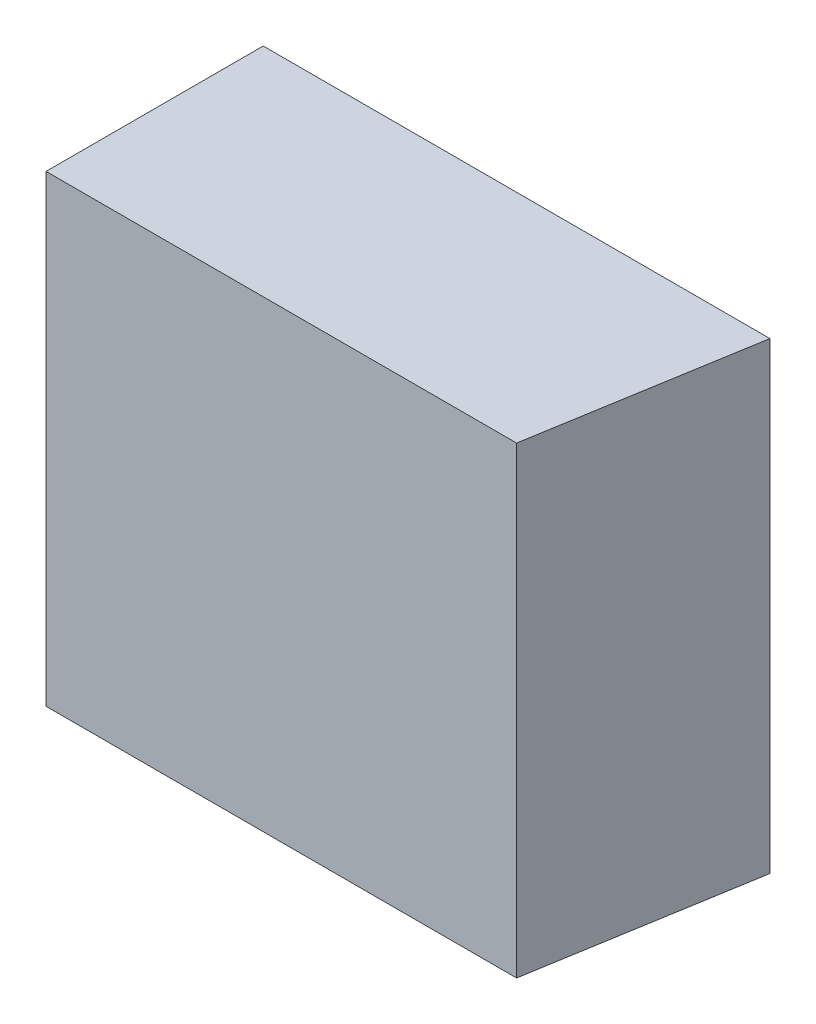
ISO-10303-21;
HEADER;
FILE_DESCRIPTION(('STEP AP214'),'2;1');
FILE_NAME('part.step','',(''),(''),'','','');
FILE_SCHEMA(('AUTOMOTIVE_DESIGN { 1 0 10303 214 1 1 1 1 }'));
ENDSEC;
DATA;
#1=APPLICATION_CONTEXT('core data for automotive mechanical design processes');
#2=APPLICATION_PROTOCOL_DEFINITION('international standard','automotive_design',2000,#1);
#3=PRODUCT_CONTEXT('',#1,'mechanical');
#4=PRODUCT('Part','Part','',(#3));
#5=PRODUCT_RELATED_PRODUCT_CATEGORY('part','',(#4));
#6=PRODUCT_DEFINITION_FORMATION('','',#4);
#7=PRODUCT_DEFINITION_CONTEXT('part definition',#1,'design');
#8=PRODUCT_DEFINITION('design','',#6,#7);
#9=PRODUCT_DEFINITION_SHAPE('','',#8);
#10=(LENGTH_UNIT() NAMED_UNIT(*) SI_UNIT(.MILLI.,.METRE.));
#11=(NAMED_UNIT(*) PLANE_ANGLE_UNIT() SI_UNIT($,.RADIAN.));
#12=(NAMED_UNIT(*) SI_UNIT($,.STERADIAN.) SOLID_ANGLE_UNIT());
#13=UNCERTAINTY_MEASURE_WITH_UNIT(LENGTH_MEASURE(1.E-05),#10,'distance_accuracy_value','');
#14=(GEOMETRIC_REPRESENTATION_CONTEXT(3) GLOBAL_UNCERTAINTY_ASSIGNED_CONTEXT((#13)) GLOBAL_UNIT_ASSIGNED_CONTEXT((#10,
#11,#12)) REPRESENTATION_CONTEXT('',''));
#15=CARTESIAN_POINT('',(0.,0.,0.));
#16=DIRECTION('',(0.,0.,1.));
#17=DIRECTION('',(1.,0.,0.));
#18=AXIS2_PLACEMENT_3D('',#15,#16,#17);
#19=CARTESIAN_POINT('',(0.,160.,0.));
#20=DIRECTION('',(0.,0.,1.));
#21=DIRECTION('',(1.,0.,0.));
#22=AXIS2_PLACEMENT_3D('',#19,#20,#21);
#23=PLANE('',#22);
#24=DIRECTION('',(-1.,0.,0.));
#25=VECTOR('',#24,1.);
#26=CARTESIAN_POINT('',(0.,-160.,0.));
#27=LINE('',#26,#25);
#28=CARTESIAN_POINT('',(200.,-160.,0.));
#29=VERTEX_POINT('',#28);
#30=CARTESIAN_POINT('',(-150.,-160.,0.));
#31=VERTEX_POINT('',#30);
#32=EDGE_CURVE('E185',#29,#31,#27,.T.);
#33=ORIENTED_EDGE('',*,*,#32,.T.);
#34=DIRECTION('',(0.,-1.,0.));
#35=VECTOR('',#34,1.);
#36=CARTESIAN_POINT('',(-150.,160.,0.));
#37=LINE('',#36,#35);
#38=CARTESIAN_POINT('',(-150.,160.,0.));
#39=VERTEX_POINT('',#38);
#40=EDGE_CURVE('E52',#39,#31,#37,.T.);
#41=ORIENTED_EDGE('',*,*,#40,.F.);
#42=DIRECTION('',(-1.,0.,0.));
#43=VECTOR('',#42,1.);
#44=CARTESIAN_POINT('',(200.,160.,0.));
#45=LINE('',#44,#43);
#46=CARTESIAN_POINT('',(200.,160.,0.));
#47=VERTEX_POINT('',#46);
#48=EDGE_CURVE('E96',#47,#39,#45,.T.);
#49=ORIENTED_EDGE('',*,*,#48,.F.);
#50=DIRECTION('',(0.,-1.,0.));
#51=VECTOR('',#50,1.);
#52=CARTESIAN_POINT('',(200.,160.,0.));
#53=LINE('',#52,#51);
#54=EDGE_CURVE('E11',#47,#29,#53,.T.);
#55=ORIENTED_EDGE('',*,*,#54,.T.);
#56=EDGE_LOOP('',(#33,#41,#49,#55));
#57=FACE_BOUND('',#56,.T.);
#58=DIRECTION('',(-1.,0.,0.));
#59=VECTOR('',#58,1.);
#60=CARTESIAN_POINT('',(0.,-156.,0.));
#61=LINE('',#60,#59);
#62=CARTESIAN_POINT('',(195.944824979801,-156.,0.));
#63=VERTEX_POINT('',#62);
#64=CARTESIAN_POINT('',(-146.,-156.,0.));
#65=VERTEX_POINT('',#64);
#66=EDGE_CURVE('E142',#63,#65,#61,.T.);
#67=ORIENTED_EDGE('',*,*,#66,.F.);
#68=DIRECTION('',(0.,-1.,0.));
#69=VECTOR('',#68,1.);
#70=CARTESIAN_POINT('',(195.944824979801,160.,0.));
#71=LINE('',#70,#69);
#72=CARTESIAN_POINT('',(195.944824979801,156.,0.));
#73=VERTEX_POINT('',#72);
#74=EDGE_CURVE('E140',#73,#63,#71,.T.);
#75=ORIENTED_EDGE('',*,*,#74,.F.);
#76=DIRECTION('',(-1.,0.,0.));
#77=VECTOR('',#76,1.);
#78=CARTESIAN_POINT('',(0.,156.,0.));
#79=LINE('',#78,#77);
#80=CARTESIAN_POINT('',(-146.,156.,0.));
#81=VERTEX_POINT('',#80);
#82=EDGE_CURVE('E148',#73,#81,#79,.T.);
#83=ORIENTED_EDGE('',*,*,#82,.T.);
#84=DIRECTION('',(0.,-1.,0.));
#85=VECTOR('',#84,1.);
#86=CARTESIAN_POINT('',(-146.,160.,0.));
#87=LINE('',#86,#85);
#88=EDGE_CURVE('E155',#81,#65,#87,.T.);
#89=ORIENTED_EDGE('',*,*,#88,.T.);
#90=EDGE_LOOP('',(#67,#75,#83,#89));
#91=FACE_BOUND('',#90,.T.);
#92=ADVANCED_FACE('F43',(#57,#91),#23,.F.);
#93=CARTESIAN_POINT('',(175.,160.,150.));
#94=DIRECTION('',(-0.986393923832144,0.,-0.164398987305357));
#95=DIRECTION('',(-0.164398987305357,0.,0.986393923832144));
#96=AXIS2_PLACEMENT_3D('',#93,#94,#95);
#97=PLANE('',#96);
#98=DIRECTION('',(0.164398987305357,0.,-0.986393923832144));
#99=VECTOR('',#98,1.);
#100=CARTESIAN_POINT('',(175.,-160.,150.));
#101=LINE('',#100,#99);
#102=CARTESIAN_POINT('',(175.,-160.,150.));
#103=VERTEX_POINT('',#102);
#104=EDGE_CURVE('E162',#103,#29,#101,.T.);
#105=ORIENTED_EDGE('',*,*,#104,.T.);
#106=ORIENTED_EDGE('',*,*,#54,.F.);
#107=DIRECTION('',(0.164398987305357,0.,-0.986393923832144));
#108=VECTOR('',#107,1.);
#109=CARTESIAN_POINT('',(175.,160.,150.));
#110=LINE('',#109,#108);
#111=CARTESIAN_POINT('',(175.,160.,150.));
#112=VERTEX_POINT('',#111);
#113=EDGE_CURVE('E170',#112,#47,#110,.T.);
#114=ORIENTED_EDGE('',*,*,#113,.F.);
#115=DIRECTION('',(0.,-1.,0.));
#116=VECTOR('',#115,1.);
#117=CARTESIAN_POINT('',(175.,160.,150.));
#118=LINE('',#117,#116);
#119=EDGE_CURVE('E181',#112,#103,#118,.T.);
#120=ORIENTED_EDGE('',*,*,#119,.T.);
#121=EDGE_LOOP('',(#105,#106,#114,#120));
#122=FACE_BOUND('',#121,.T.);
#123=ADVANCED_FACE('F45',(#122),#97,.F.);
#124=CARTESIAN_POINT('',(-150.,160.,150.));
#125=DIRECTION('',(-1.,0.,0.));
#126=DIRECTION('',(0.,0.,1.));
#127=AXIS2_PLACEMENT_3D('',#124,#125,#126);
#128=PLANE('',#127);
#129=DIRECTION('',(0.,0.,-1.));
#130=VECTOR('',#129,1.);
#131=CARTESIAN_POINT('',(-150.,-160.,150.));
#132=LINE('',#131,#130);
#133=CARTESIAN_POINT('',(-150.,-160.,150.));
#134=VERTEX_POINT('',#133);
#135=EDGE_CURVE('E189',#134,#31,#132,.T.);
#136=ORIENTED_EDGE('',*,*,#135,.F.);
#137=DIRECTION('',(0.,-1.,0.));
#138=VECTOR('',#137,1.);
#139=CARTESIAN_POINT('',(-150.,160.,150.));
#140=LINE('',#139,#138);
#141=CARTESIAN_POINT('',(-150.,160.,150.));
#142=VERTEX_POINT('',#141);
#143=EDGE_CURVE('E197',#142,#134,#140,.T.);
#144=ORIENTED_EDGE('',*,*,#143,.F.);
#145=DIRECTION('',(0.,0.,-1.));
#146=VECTOR('',#145,1.);
#147=CARTESIAN_POINT('',(-150.,160.,150.));
#148=LINE('',#147,#146);
#149=EDGE_CURVE('E175',#142,#39,#148,.T.);
#150=ORIENTED_EDGE('',*,*,#149,.T.);
#151=ORIENTED_EDGE('',*,*,#40,.T.);
#152=EDGE_LOOP('',(#136,#144,#150,#151));
#153=FACE_BOUND('',#152,.T.);
#154=ADVANCED_FACE('F202',(#153),#128,.T.);
#155=CARTESIAN_POINT('',(-150.,160.,150.));
#156=DIRECTION('',(0.,0.,-1.));
#157=DIRECTION('',(-1.,0.,0.));
#158=AXIS2_PLACEMENT_3D('',#155,#156,#157);
#159=PLANE('',#158);
#160=DIRECTION('',(1.,0.,0.));
#161=VECTOR('',#160,1.);
#162=CARTESIAN_POINT('',(-150.,-160.,150.));
#163=LINE('',#162,#161);
#164=EDGE_CURVE('E89',#134,#103,#163,.T.);
#165=ORIENTED_EDGE('',*,*,#164,.T.);
#166=ORIENTED_EDGE('',*,*,#119,.F.);
#167=DIRECTION('',(1.,0.,0.));
#168=VECTOR('',#167,1.);
#169=CARTESIAN_POINT('',(-150.,160.,150.));
#170=LINE('',#169,#168);
#171=EDGE_CURVE('E68',#142,#112,#170,.T.);
#172=ORIENTED_EDGE('',*,*,#171,.F.);
#173=ORIENTED_EDGE('',*,*,#143,.T.);
#174=EDGE_LOOP('',(#165,#166,#172,#173));
#175=FACE_BOUND('',#174,.T.);
#176=ADVANCED_FACE('F210',(#175),#159,.F.);
#177=CARTESIAN_POINT('',(0.,160.,0.));
#178=DIRECTION('',(0.,1.,0.));
#179=DIRECTION('',(0.,0.,1.));
#180=AXIS2_PLACEMENT_3D('',#177,#178,#179);
#181=PLANE('',#180);
#182=ORIENTED_EDGE('',*,*,#113,.T.);
#183=ORIENTED_EDGE('',*,*,#48,.T.);
#184=ORIENTED_EDGE('',*,*,#149,.F.);
#185=ORIENTED_EDGE('',*,*,#171,.T.);
#186=EDGE_LOOP('',(#182,#183,#184,#185));
#187=FACE_BOUND('',#186,.T.);
#188=ADVANCED_FACE('F211',(#187),#181,.T.);
#189=CARTESIAN_POINT('',(0.,-160.,0.));
#190=DIRECTION('',(0.,1.,0.));
#191=DIRECTION('',(0.,0.,1.));
#192=AXIS2_PLACEMENT_3D('',#189,#190,#191);
#193=PLANE('',#192);
#194=ORIENTED_EDGE('',*,*,#104,.F.);
#195=ORIENTED_EDGE('',*,*,#164,.F.);
#196=ORIENTED_EDGE('',*,*,#135,.T.);
#197=ORIENTED_EDGE('',*,*,#32,.F.);
#198=EDGE_LOOP('',(#194,#195,#196,#197));
#199=FACE_BOUND('',#198,.T.);
#200=ADVANCED_FACE('F207',(#199),#193,.F.);
#201=CARTESIAN_POINT('',(171.054424304671,160.,149.342404050779));
#202=DIRECTION('',(-0.986393923832144,0.,-0.164398987305357));
#203=DIRECTION('',(-0.164398987305357,0.,0.986393923832144));
#204=AXIS2_PLACEMENT_3D('',#201,#202,#203);
#205=PLANE('',#204);
#206=DIRECTION('',(0.164398987305357,0.,-0.986393923832144));
#207=VECTOR('',#206,1.);
#208=CARTESIAN_POINT('',(171.054424304671,-156.,149.342404050779));
#209=LINE('',#208,#207);
#210=CARTESIAN_POINT('',(171.611491646468,-156.,146.));
#211=VERTEX_POINT('',#210);
#212=EDGE_CURVE('E124',#211,#63,#209,.T.);
#213=ORIENTED_EDGE('',*,*,#212,.F.);
#214=DIRECTION('',(0.,-1.,0.));
#215=VECTOR('',#214,1.);
#216=CARTESIAN_POINT('',(171.611491646468,160.,146.));
#217=LINE('',#216,#215);
#218=CARTESIAN_POINT('',(171.611491646468,156.,146.));
#219=VERTEX_POINT('',#218);
#220=EDGE_CURVE('E131',#219,#211,#217,.T.);
#221=ORIENTED_EDGE('',*,*,#220,.F.);
#222=DIRECTION('',(0.164398987305357,0.,-0.986393923832144));
#223=VECTOR('',#222,1.);
#224=CARTESIAN_POINT('',(171.054424304671,156.,149.342404050779));
#225=LINE('',#224,#223);
#226=EDGE_CURVE('E59',#219,#73,#225,.T.);
#227=ORIENTED_EDGE('',*,*,#226,.T.);
#228=ORIENTED_EDGE('',*,*,#74,.T.);
#229=EDGE_LOOP('',(#213,#221,#227,#228));
#230=FACE_BOUND('',#229,.T.);
#231=ADVANCED_FACE('F138',(#230),#205,.T.);
#232=CARTESIAN_POINT('',(-146.,160.,150.));
#233=DIRECTION('',(-1.,0.,0.));
#234=DIRECTION('',(0.,0.,1.));
#235=AXIS2_PLACEMENT_3D('',#232,#233,#234);
#236=PLANE('',#235);
#237=DIRECTION('',(0.,0.,-1.));
#238=VECTOR('',#237,1.);
#239=CARTESIAN_POINT('',(-146.,-156.,150.));
#240=LINE('',#239,#238);
#241=CARTESIAN_POINT('',(-146.,-156.,146.));
#242=VERTEX_POINT('',#241);
#243=EDGE_CURVE('E127',#242,#65,#240,.T.);
#244=ORIENTED_EDGE('',*,*,#243,.T.);
#245=ORIENTED_EDGE('',*,*,#88,.F.);
#246=DIRECTION('',(0.,0.,-1.));
#247=VECTOR('',#246,1.);
#248=CARTESIAN_POINT('',(-146.,156.,150.));
#249=LINE('',#248,#247);
#250=CARTESIAN_POINT('',(-146.,156.,146.));
#251=VERTEX_POINT('',#250);
#252=EDGE_CURVE('E152',#251,#81,#249,.T.);
#253=ORIENTED_EDGE('',*,*,#252,.F.);
#254=DIRECTION('',(0.,-1.,0.));
#255=VECTOR('',#254,1.);
#256=CARTESIAN_POINT('',(-146.,160.,146.));
#257=LINE('',#256,#255);
#258=EDGE_CURVE('E136',#251,#242,#257,.T.);
#259=ORIENTED_EDGE('',*,*,#258,.T.);
#260=EDGE_LOOP('',(#244,#245,#253,#259));
#261=FACE_BOUND('',#260,.T.);
#262=ADVANCED_FACE('F263',(#261),#236,.F.);
#263=CARTESIAN_POINT('',(-150.,160.,146.));
#264=DIRECTION('',(0.,0.,-1.));
#265=DIRECTION('',(-1.,0.,0.));
#266=AXIS2_PLACEMENT_3D('',#263,#264,#265);
#267=PLANE('',#266);
#268=DIRECTION('',(1.,0.,0.));
#269=VECTOR('',#268,1.);
#270=CARTESIAN_POINT('',(-150.,-156.,146.));
#271=LINE('',#270,#269);
#272=EDGE_CURVE('E120',#242,#211,#271,.T.);
#273=ORIENTED_EDGE('',*,*,#272,.F.);
#274=ORIENTED_EDGE('',*,*,#258,.F.);
#275=DIRECTION('',(1.,0.,0.));
#276=VECTOR('',#275,1.);
#277=CARTESIAN_POINT('',(-150.,156.,146.));
#278=LINE('',#277,#276);
#279=EDGE_CURVE('E134',#251,#219,#278,.T.);
#280=ORIENTED_EDGE('',*,*,#279,.T.);
#281=ORIENTED_EDGE('',*,*,#220,.T.);
#282=EDGE_LOOP('',(#273,#274,#280,#281));
#283=FACE_BOUND('',#282,.T.);
#284=ADVANCED_FACE('F132',(#283),#267,.T.);
#285=CARTESIAN_POINT('',(0.,156.,0.));
#286=DIRECTION('',(0.,1.,0.));
#287=DIRECTION('',(0.,0.,1.));
#288=AXIS2_PLACEMENT_3D('',#285,#286,#287);
#289=PLANE('',#288);
#290=ORIENTED_EDGE('',*,*,#226,.F.);
#291=ORIENTED_EDGE('',*,*,#279,.F.);
#292=ORIENTED_EDGE('',*,*,#252,.T.);
#293=ORIENTED_EDGE('',*,*,#82,.F.);
#294=EDGE_LOOP('',(#290,#291,#292,#293));
#295=FACE_BOUND('',#294,.T.);
#296=ADVANCED_FACE('F282',(#295),#289,.F.);
#297=CARTESIAN_POINT('',(0.,-156.,0.));
#298=DIRECTION('',(0.,1.,0.));
#299=DIRECTION('',(0.,0.,1.));
#300=AXIS2_PLACEMENT_3D('',#297,#298,#299);
#301=PLANE('',#300);
#302=ORIENTED_EDGE('',*,*,#212,.T.);
#303=ORIENTED_EDGE('',*,*,#66,.T.);
#304=ORIENTED_EDGE('',*,*,#243,.F.);
#305=ORIENTED_EDGE('',*,*,#272,.T.);
#306=EDGE_LOOP('',(#302,#303,#304,#305));
#307=FACE_BOUND('',#306,.T.);
#308=ADVANCED_FACE('F122',(#307),#301,.T.);
#309=CLOSED_SHELL('',(#92,#123,#154,#176,#188,#200,#231,#262,#284,#296,#308));
#310=MANIFOLD_SOLID_BREP('B2',#309);
#311=ADVANCED_BREP_SHAPE_REPRESENTATION('',(#18,#310),#14);
#312=SHAPE_DEFINITION_REPRESENTATION(#9,#311);
ENDSEC;
END-ISO-10303-21;
